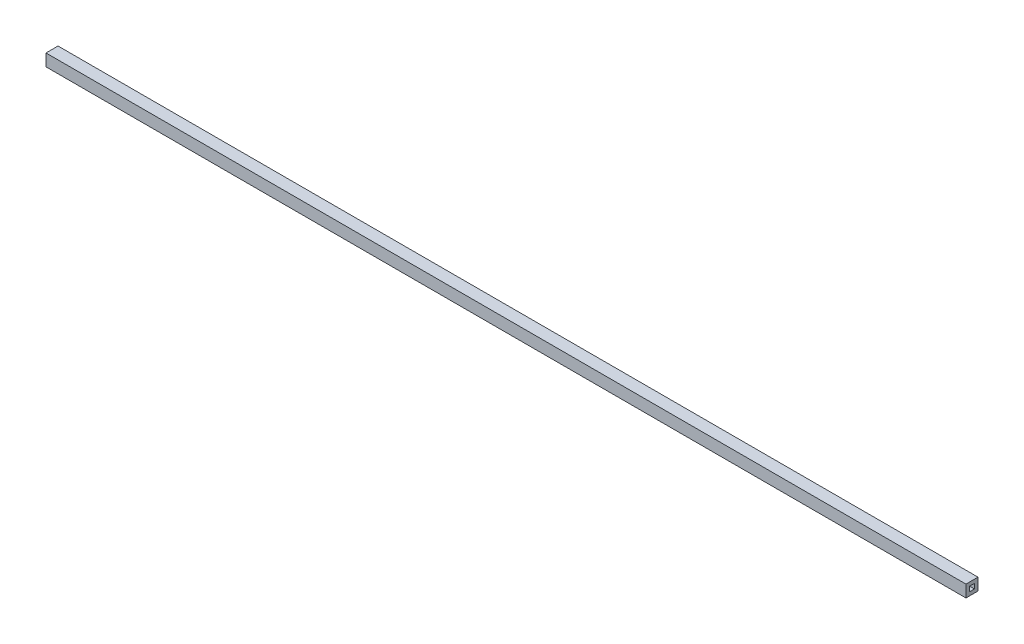
ISO-10303-21;
HEADER;
FILE_DESCRIPTION(('STEP AP214'),'2;1');
FILE_NAME('part.step','',(''),(''),'','','');
FILE_SCHEMA(('AUTOMOTIVE_DESIGN { 1 0 10303 214 1 1 1 1 }'));
ENDSEC;
DATA;
#1=APPLICATION_CONTEXT('core data for automotive mechanical design processes');
#2=APPLICATION_PROTOCOL_DEFINITION('international standard','automotive_design',2000,#1);
#3=PRODUCT_CONTEXT('',#1,'mechanical');
#4=PRODUCT('Part','Part','',(#3));
#5=PRODUCT_RELATED_PRODUCT_CATEGORY('part','',(#4));
#6=PRODUCT_DEFINITION_FORMATION('','',#4);
#7=PRODUCT_DEFINITION_CONTEXT('part definition',#1,'design');
#8=PRODUCT_DEFINITION('design','',#6,#7);
#9=PRODUCT_DEFINITION_SHAPE('','',#8);
#10=(LENGTH_UNIT() NAMED_UNIT(*) SI_UNIT(.MILLI.,.METRE.));
#11=(NAMED_UNIT(*) PLANE_ANGLE_UNIT() SI_UNIT($,.RADIAN.));
#12=(NAMED_UNIT(*) SI_UNIT($,.STERADIAN.) SOLID_ANGLE_UNIT());
#13=UNCERTAINTY_MEASURE_WITH_UNIT(LENGTH_MEASURE(1.E-05),#10,'distance_accuracy_value','');
#14=(GEOMETRIC_REPRESENTATION_CONTEXT(3) GLOBAL_UNCERTAINTY_ASSIGNED_CONTEXT((#13)) GLOBAL_UNIT_ASSIGNED_CONTEXT((#10,
#11,#12)) REPRESENTATION_CONTEXT('',''));
#15=CARTESIAN_POINT('',(0.,0.,0.));
#16=DIRECTION('',(0.,0.,1.));
#17=DIRECTION('',(1.,0.,0.));
#18=AXIS2_PLACEMENT_3D('',#15,#16,#17);
#19=CARTESIAN_POINT('',(382.,0.,0.));
#20=DIRECTION('',(1.,0.,0.));
#21=DIRECTION('',(0.,0.,-1.));
#22=AXIS2_PLACEMENT_3D('',#19,#20,#21);
#23=PLANE('',#22);
#24=DIRECTION('',(0.,1.,0.));
#25=VECTOR('',#24,1.);
#26=CARTESIAN_POINT('',(382.,2.5,-2.5));
#27=LINE('',#26,#25);
#28=CARTESIAN_POINT('',(382.,-2.5,-2.5));
#29=VERTEX_POINT('',#28);
#30=CARTESIAN_POINT('',(382.,2.5,-2.5));
#31=VERTEX_POINT('',#30);
#32=EDGE_CURVE('E159',#29,#31,#27,.T.);
#33=ORIENTED_EDGE('',*,*,#32,.T.);
#34=DIRECTION('',(0.,0.,1.));
#35=VECTOR('',#34,1.);
#36=CARTESIAN_POINT('',(382.,2.5,2.5));
#37=LINE('',#36,#35);
#38=CARTESIAN_POINT('',(382.,2.5,2.5));
#39=VERTEX_POINT('',#38);
#40=EDGE_CURVE('E163',#31,#39,#37,.T.);
#41=ORIENTED_EDGE('',*,*,#40,.T.);
#42=DIRECTION('',(0.,-1.,0.));
#43=VECTOR('',#42,1.);
#44=CARTESIAN_POINT('',(382.,2.5,2.5));
#45=LINE('',#44,#43);
#46=CARTESIAN_POINT('',(382.,-2.5,2.5));
#47=VERTEX_POINT('',#46);
#48=EDGE_CURVE('E167',#39,#47,#45,.T.);
#49=ORIENTED_EDGE('',*,*,#48,.T.);
#50=DIRECTION('',(0.,0.,-1.));
#51=VECTOR('',#50,1.);
#52=CARTESIAN_POINT('',(382.,-2.5,2.5));
#53=LINE('',#52,#51);
#54=EDGE_CURVE('E170',#47,#29,#53,.T.);
#55=ORIENTED_EDGE('',*,*,#54,.T.);
#56=EDGE_LOOP('',(#33,#41,#49,#55));
#57=FACE_BOUND('',#56,.T.);
#58=DIRECTION('',(0.,0.,1.));
#59=VECTOR('',#58,1.);
#60=CARTESIAN_POINT('',(382.,1.,1.));
#61=LINE('',#60,#59);
#62=CARTESIAN_POINT('',(382.,1.,-1.));
#63=VERTEX_POINT('',#62);
#64=CARTESIAN_POINT('',(382.,1.,1.));
#65=VERTEX_POINT('',#64);
#66=EDGE_CURVE('E120',#63,#65,#61,.T.);
#67=ORIENTED_EDGE('',*,*,#66,.F.);
#68=DIRECTION('',(0.,1.,0.));
#69=VECTOR('',#68,1.);
#70=CARTESIAN_POINT('',(382.,1.,-1.));
#71=LINE('',#70,#69);
#72=CARTESIAN_POINT('',(382.,-1.,-1.));
#73=VERTEX_POINT('',#72);
#74=EDGE_CURVE('E111',#73,#63,#71,.T.);
#75=ORIENTED_EDGE('',*,*,#74,.F.);
#76=DIRECTION('',(0.,0.,-1.));
#77=VECTOR('',#76,1.);
#78=CARTESIAN_POINT('',(382.,-1.,1.));
#79=LINE('',#78,#77);
#80=CARTESIAN_POINT('',(382.,-1.,1.));
#81=VERTEX_POINT('',#80);
#82=EDGE_CURVE('E137',#81,#73,#79,.T.);
#83=ORIENTED_EDGE('',*,*,#82,.F.);
#84=DIRECTION('',(0.,-1.,0.));
#85=VECTOR('',#84,1.);
#86=CARTESIAN_POINT('',(382.,1.,1.));
#87=LINE('',#86,#85);
#88=EDGE_CURVE('E133',#65,#81,#87,.T.);
#89=ORIENTED_EDGE('',*,*,#88,.F.);
#90=EDGE_LOOP('',(#67,#75,#83,#89));
#91=FACE_BOUND('',#90,.T.);
#92=ADVANCED_FACE('F45',(#57,#91),#23,.T.);
#93=CARTESIAN_POINT('',(0.,0.,0.));
#94=DIRECTION('',(1.,0.,0.));
#95=DIRECTION('',(0.,0.,-1.));
#96=AXIS2_PLACEMENT_3D('',#93,#94,#95);
#97=PLANE('',#96);
#98=DIRECTION('',(0.,1.,0.));
#99=VECTOR('',#98,1.);
#100=CARTESIAN_POINT('',(0.,2.5,-2.5));
#101=LINE('',#100,#99);
#102=CARTESIAN_POINT('',(0.,-2.5,-2.5));
#103=VERTEX_POINT('',#102);
#104=CARTESIAN_POINT('',(0.,2.5,-2.5));
#105=VERTEX_POINT('',#104);
#106=EDGE_CURVE('E129',#103,#105,#101,.T.);
#107=ORIENTED_EDGE('',*,*,#106,.F.);
#108=DIRECTION('',(0.,0.,-1.));
#109=VECTOR('',#108,1.);
#110=CARTESIAN_POINT('',(0.,-2.5,2.5));
#111=LINE('',#110,#109);
#112=CARTESIAN_POINT('',(0.,-2.5,2.5));
#113=VERTEX_POINT('',#112);
#114=EDGE_CURVE('E164',#113,#103,#111,.T.);
#115=ORIENTED_EDGE('',*,*,#114,.F.);
#116=DIRECTION('',(0.,-1.,0.));
#117=VECTOR('',#116,1.);
#118=CARTESIAN_POINT('',(0.,2.5,2.5));
#119=LINE('',#118,#117);
#120=CARTESIAN_POINT('',(0.,2.5,2.5));
#121=VERTEX_POINT('',#120);
#122=EDGE_CURVE('E180',#121,#113,#119,.T.);
#123=ORIENTED_EDGE('',*,*,#122,.F.);
#124=DIRECTION('',(0.,0.,1.));
#125=VECTOR('',#124,1.);
#126=CARTESIAN_POINT('',(0.,2.5,2.5));
#127=LINE('',#126,#125);
#128=EDGE_CURVE('E177',#105,#121,#127,.T.);
#129=ORIENTED_EDGE('',*,*,#128,.F.);
#130=EDGE_LOOP('',(#107,#115,#123,#129));
#131=FACE_BOUND('',#130,.T.);
#132=DIRECTION('',(0.,1.,0.));
#133=VECTOR('',#132,1.);
#134=CARTESIAN_POINT('',(0.,1.,-1.));
#135=LINE('',#134,#133);
#136=CARTESIAN_POINT('',(0.,-1.,-1.));
#137=VERTEX_POINT('',#136);
#138=CARTESIAN_POINT('',(0.,1.,-1.));
#139=VERTEX_POINT('',#138);
#140=EDGE_CURVE('E69',#137,#139,#135,.T.);
#141=ORIENTED_EDGE('',*,*,#140,.T.);
#142=DIRECTION('',(0.,0.,1.));
#143=VECTOR('',#142,1.);
#144=CARTESIAN_POINT('',(0.,1.,1.));
#145=LINE('',#144,#143);
#146=CARTESIAN_POINT('',(0.,1.,1.));
#147=VERTEX_POINT('',#146);
#148=EDGE_CURVE('E127',#139,#147,#145,.T.);
#149=ORIENTED_EDGE('',*,*,#148,.T.);
#150=DIRECTION('',(0.,-1.,0.));
#151=VECTOR('',#150,1.);
#152=CARTESIAN_POINT('',(0.,1.,1.));
#153=LINE('',#152,#151);
#154=CARTESIAN_POINT('',(0.,-1.,1.));
#155=VERTEX_POINT('',#154);
#156=EDGE_CURVE('E146',#147,#155,#153,.T.);
#157=ORIENTED_EDGE('',*,*,#156,.T.);
#158=DIRECTION('',(0.,0.,-1.));
#159=VECTOR('',#158,1.);
#160=CARTESIAN_POINT('',(0.,-1.,1.));
#161=LINE('',#160,#159);
#162=EDGE_CURVE('E121',#155,#137,#161,.T.);
#163=ORIENTED_EDGE('',*,*,#162,.T.);
#164=EDGE_LOOP('',(#141,#149,#157,#163));
#165=FACE_BOUND('',#164,.T.);
#166=ADVANCED_FACE('F203',(#131,#165),#97,.F.);
#167=CARTESIAN_POINT('',(382.,2.5,-2.5));
#168=DIRECTION('',(0.,0.,1.));
#169=DIRECTION('',(0.,-1.,0.));
#170=AXIS2_PLACEMENT_3D('',#167,#168,#169);
#171=PLANE('',#170);
#172=ORIENTED_EDGE('',*,*,#106,.T.);
#173=DIRECTION('',(-1.,0.,0.));
#174=VECTOR('',#173,1.);
#175=CARTESIAN_POINT('',(382.,2.5,-2.5));
#176=LINE('',#175,#174);
#177=EDGE_CURVE('E11',#31,#105,#176,.T.);
#178=ORIENTED_EDGE('',*,*,#177,.F.);
#179=ORIENTED_EDGE('',*,*,#32,.F.);
#180=DIRECTION('',(-1.,0.,0.));
#181=VECTOR('',#180,1.);
#182=CARTESIAN_POINT('',(382.,-2.5,-2.5));
#183=LINE('',#182,#181);
#184=EDGE_CURVE('E173',#29,#103,#183,.T.);
#185=ORIENTED_EDGE('',*,*,#184,.T.);
#186=EDGE_LOOP('',(#172,#178,#179,#185));
#187=FACE_BOUND('',#186,.T.);
#188=ADVANCED_FACE('F47',(#187),#171,.F.);
#189=CARTESIAN_POINT('',(382.,2.5,2.5));
#190=DIRECTION('',(0.,-1.,0.));
#191=DIRECTION('',(0.,0.,-1.));
#192=AXIS2_PLACEMENT_3D('',#189,#190,#191);
#193=PLANE('',#192);
#194=ORIENTED_EDGE('',*,*,#128,.T.);
#195=DIRECTION('',(-1.,0.,0.));
#196=VECTOR('',#195,1.);
#197=CARTESIAN_POINT('',(382.,2.5,2.5));
#198=LINE('',#197,#196);
#199=EDGE_CURVE('E54',#39,#121,#198,.T.);
#200=ORIENTED_EDGE('',*,*,#199,.F.);
#201=ORIENTED_EDGE('',*,*,#40,.F.);
#202=ORIENTED_EDGE('',*,*,#177,.T.);
#203=EDGE_LOOP('',(#194,#200,#201,#202));
#204=FACE_BOUND('',#203,.T.);
#205=ADVANCED_FACE('F213',(#204),#193,.F.);
#206=CARTESIAN_POINT('',(382.,2.5,2.5));
#207=DIRECTION('',(0.,0.,-1.));
#208=DIRECTION('',(0.,1.,0.));
#209=AXIS2_PLACEMENT_3D('',#206,#207,#208);
#210=PLANE('',#209);
#211=ORIENTED_EDGE('',*,*,#122,.T.);
#212=DIRECTION('',(-1.,0.,0.));
#213=VECTOR('',#212,1.);
#214=CARTESIAN_POINT('',(382.,-2.5,2.5));
#215=LINE('',#214,#213);
#216=EDGE_CURVE('E188',#47,#113,#215,.T.);
#217=ORIENTED_EDGE('',*,*,#216,.F.);
#218=ORIENTED_EDGE('',*,*,#48,.F.);
#219=ORIENTED_EDGE('',*,*,#199,.T.);
#220=EDGE_LOOP('',(#211,#217,#218,#219));
#221=FACE_BOUND('',#220,.T.);
#222=ADVANCED_FACE('F197',(#221),#210,.F.);
#223=CARTESIAN_POINT('',(382.,-2.5,2.5));
#224=DIRECTION('',(0.,1.,0.));
#225=DIRECTION('',(0.,0.,1.));
#226=AXIS2_PLACEMENT_3D('',#223,#224,#225);
#227=PLANE('',#226);
#228=ORIENTED_EDGE('',*,*,#114,.T.);
#229=ORIENTED_EDGE('',*,*,#184,.F.);
#230=ORIENTED_EDGE('',*,*,#54,.F.);
#231=ORIENTED_EDGE('',*,*,#216,.T.);
#232=EDGE_LOOP('',(#228,#229,#230,#231));
#233=FACE_BOUND('',#232,.T.);
#234=ADVANCED_FACE('F207',(#233),#227,.F.);
#235=CARTESIAN_POINT('',(382.,1.,-1.));
#236=DIRECTION('',(0.,0.,1.));
#237=DIRECTION('',(1.,0.,0.));
#238=AXIS2_PLACEMENT_3D('',#235,#236,#237);
#239=PLANE('',#238);
#240=ORIENTED_EDGE('',*,*,#140,.F.);
#241=DIRECTION('',(-1.,0.,0.));
#242=VECTOR('',#241,1.);
#243=CARTESIAN_POINT('',(382.,-1.,-1.));
#244=LINE('',#243,#242);
#245=EDGE_CURVE('E115',#73,#137,#244,.T.);
#246=ORIENTED_EDGE('',*,*,#245,.F.);
#247=ORIENTED_EDGE('',*,*,#74,.T.);
#248=DIRECTION('',(-1.,0.,0.));
#249=VECTOR('',#248,1.);
#250=CARTESIAN_POINT('',(382.,1.,-1.));
#251=LINE('',#250,#249);
#252=EDGE_CURVE('E114',#63,#139,#251,.T.);
#253=ORIENTED_EDGE('',*,*,#252,.T.);
#254=EDGE_LOOP('',(#240,#246,#247,#253));
#255=FACE_BOUND('',#254,.T.);
#256=ADVANCED_FACE('F113',(#255),#239,.T.);
#257=CARTESIAN_POINT('',(382.,1.,1.));
#258=DIRECTION('',(0.,-1.,0.));
#259=DIRECTION('',(0.,0.,-1.));
#260=AXIS2_PLACEMENT_3D('',#257,#258,#259);
#261=PLANE('',#260);
#262=ORIENTED_EDGE('',*,*,#148,.F.);
#263=ORIENTED_EDGE('',*,*,#252,.F.);
#264=ORIENTED_EDGE('',*,*,#66,.T.);
#265=DIRECTION('',(-1.,0.,0.));
#266=VECTOR('',#265,1.);
#267=CARTESIAN_POINT('',(382.,1.,1.));
#268=LINE('',#267,#266);
#269=EDGE_CURVE('E130',#65,#147,#268,.T.);
#270=ORIENTED_EDGE('',*,*,#269,.T.);
#271=EDGE_LOOP('',(#262,#263,#264,#270));
#272=FACE_BOUND('',#271,.T.);
#273=ADVANCED_FACE('F124',(#272),#261,.T.);
#274=CARTESIAN_POINT('',(382.,1.,1.));
#275=DIRECTION('',(0.,0.,-1.));
#276=DIRECTION('',(-1.,0.,0.));
#277=AXIS2_PLACEMENT_3D('',#274,#275,#276);
#278=PLANE('',#277);
#279=ORIENTED_EDGE('',*,*,#156,.F.);
#280=ORIENTED_EDGE('',*,*,#269,.F.);
#281=ORIENTED_EDGE('',*,*,#88,.T.);
#282=DIRECTION('',(-1.,0.,0.));
#283=VECTOR('',#282,1.);
#284=CARTESIAN_POINT('',(382.,-1.,1.));
#285=LINE('',#284,#283);
#286=EDGE_CURVE('E61',#81,#155,#285,.T.);
#287=ORIENTED_EDGE('',*,*,#286,.T.);
#288=EDGE_LOOP('',(#279,#280,#281,#287));
#289=FACE_BOUND('',#288,.T.);
#290=ADVANCED_FACE('F236',(#289),#278,.T.);
#291=CARTESIAN_POINT('',(382.,-1.,1.));
#292=DIRECTION('',(0.,1.,0.));
#293=DIRECTION('',(0.,0.,1.));
#294=AXIS2_PLACEMENT_3D('',#291,#292,#293);
#295=PLANE('',#294);
#296=ORIENTED_EDGE('',*,*,#162,.F.);
#297=ORIENTED_EDGE('',*,*,#286,.F.);
#298=ORIENTED_EDGE('',*,*,#82,.T.);
#299=ORIENTED_EDGE('',*,*,#245,.T.);
#300=EDGE_LOOP('',(#296,#297,#298,#299));
#301=FACE_BOUND('',#300,.T.);
#302=ADVANCED_FACE('F240',(#301),#295,.T.);
#303=CLOSED_SHELL('',(#92,#166,#188,#205,#222,#234,#256,#273,#290,#302));
#304=MANIFOLD_SOLID_BREP('B2',#303);
#305=ADVANCED_BREP_SHAPE_REPRESENTATION('',(#18,#304),#14);
#306=SHAPE_DEFINITION_REPRESENTATION(#9,#305);
ENDSEC;
END-ISO-10303-21;
